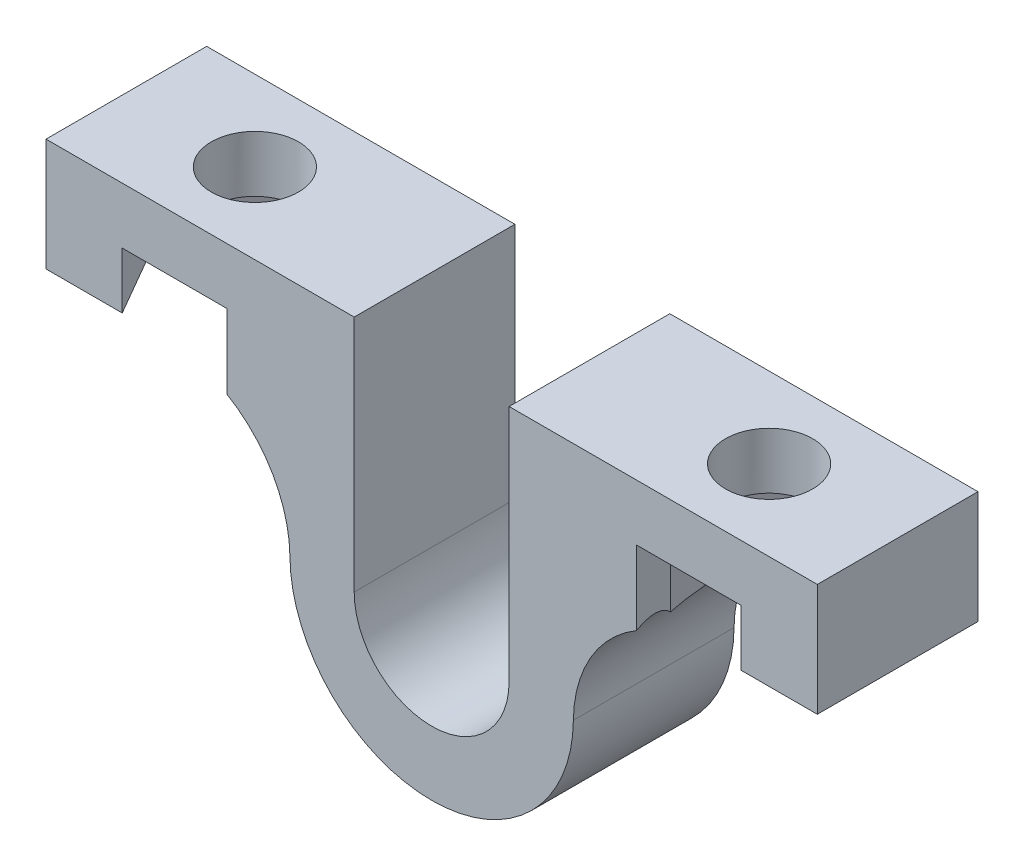
ISO-10303-21;
HEADER;
FILE_DESCRIPTION(('STEP AP214'),'2;1');
FILE_NAME('part.step','',(''),(''),'','','');
FILE_SCHEMA(('AUTOMOTIVE_DESIGN { 1 0 10303 214 1 1 1 1 }'));
ENDSEC;
DATA;
#1=APPLICATION_CONTEXT('core data for automotive mechanical design processes');
#2=APPLICATION_PROTOCOL_DEFINITION('international standard','automotive_design',2000,#1);
#3=PRODUCT_CONTEXT('',#1,'mechanical');
#4=PRODUCT('Part','Part','',(#3));
#5=PRODUCT_RELATED_PRODUCT_CATEGORY('part','',(#4));
#6=PRODUCT_DEFINITION_FORMATION('','',#4);
#7=PRODUCT_DEFINITION_CONTEXT('part definition',#1,'design');
#8=PRODUCT_DEFINITION('design','',#6,#7);
#9=PRODUCT_DEFINITION_SHAPE('','',#8);
#10=(LENGTH_UNIT() NAMED_UNIT(*) SI_UNIT(.MILLI.,.METRE.));
#11=(NAMED_UNIT(*) PLANE_ANGLE_UNIT() SI_UNIT($,.RADIAN.));
#12=(NAMED_UNIT(*) SI_UNIT($,.STERADIAN.) SOLID_ANGLE_UNIT());
#13=UNCERTAINTY_MEASURE_WITH_UNIT(LENGTH_MEASURE(1.E-05),#10,'distance_accuracy_value','');
#14=(GEOMETRIC_REPRESENTATION_CONTEXT(3) GLOBAL_UNCERTAINTY_ASSIGNED_CONTEXT((#13)) GLOBAL_UNIT_ASSIGNED_CONTEXT((#10,
#11,#12)) REPRESENTATION_CONTEXT('',''));
#15=CARTESIAN_POINT('',(0.,0.,0.));
#16=DIRECTION('',(0.,0.,1.));
#17=DIRECTION('',(1.,0.,0.));
#18=AXIS2_PLACEMENT_3D('',#15,#16,#17);
#19=CARTESIAN_POINT('',(-19.05,6.207125,7.9375));
#20=DIRECTION('',(0.,1.,0.));
#21=DIRECTION('',(0.,0.,1.));
#22=AXIS2_PLACEMENT_3D('',#19,#20,#21);
#23=PLANE('',#22);
#24=DIRECTION('',(-0.5,0.,-0.866025403784439));
#25=VECTOR('',#24,1.);
#26=CARTESIAN_POINT('',(-16.2259896131959,6.207125,6.30705684298438));
#27=LINE('',#26,#25);
#28=CARTESIAN_POINT('',(-15.2846528175946,6.207125,7.9375));
#29=VERTEX_POINT('',#28);
#30=CARTESIAN_POINT('',(-17.5760116984409,6.207125,3.96875));
#31=VERTEX_POINT('',#30);
#32=EDGE_CURVE('E183',#29,#31,#27,.T.);
#33=ORIENTED_EDGE('',*,*,#32,.F.);
#34=DIRECTION('',(1.,0.,0.));
#35=VECTOR('',#34,1.);
#36=CARTESIAN_POINT('',(-19.05,6.207125,7.9375));
#37=LINE('',#36,#35);
#38=CARTESIAN_POINT('',(-19.05,6.207125,7.9375));
#39=VERTEX_POINT('',#38);
#40=EDGE_CURVE('E142',#39,#29,#37,.T.);
#41=ORIENTED_EDGE('',*,*,#40,.F.);
#42=DIRECTION('',(0.,0.,-1.));
#43=VECTOR('',#42,1.);
#44=CARTESIAN_POINT('',(-19.05,6.207125,7.9375));
#45=LINE('',#44,#43);
#46=CARTESIAN_POINT('',(-19.05,6.207125,0.));
#47=VERTEX_POINT('',#46);
#48=EDGE_CURVE('E123',#39,#47,#45,.T.);
#49=ORIENTED_EDGE('',*,*,#48,.T.);
#50=DIRECTION('',(1.,0.,0.));
#51=VECTOR('',#50,1.);
#52=CARTESIAN_POINT('',(-19.05,6.207125,0.));
#53=LINE('',#52,#51);
#54=CARTESIAN_POINT('',(-15.2846528175946,6.207125,0.));
#55=VERTEX_POINT('',#54);
#56=EDGE_CURVE('E127',#47,#55,#53,.T.);
#57=ORIENTED_EDGE('',*,*,#56,.T.);
#58=DIRECTION('',(0.5,0.,-0.866025403784439));
#59=VECTOR('',#58,1.);
#60=CARTESIAN_POINT('',(-19.6630279344654,6.207125,7.58356815701562));
#61=LINE('',#60,#59);
#62=EDGE_CURVE('E187',#31,#55,#61,.T.);
#63=ORIENTED_EDGE('',*,*,#62,.F.);
#64=EDGE_LOOP('',(#33,#41,#49,#57,#63));
#65=FACE_BOUND('',#64,.T.);
#66=ADVANCED_FACE('F35',(#65),#23,.F.);
#67=CARTESIAN_POINT('',(-13.3501104864342,-0.142875000000001,7.9375));
#68=DIRECTION('',(0.,0.,-1.));
#69=DIRECTION('',(-1.,0.,0.));
#70=AXIS2_PLACEMENT_3D('',#67,#68,#69);
#71=CYLINDRICAL_SURFACE('',#70,6.35);
#72=CARTESIAN_POINT('',(-13.3501104864342,-0.142875000000001,-5.60277439303745));
#73=DIRECTION('',(-0.866025403784439,0.,0.5));
#74=DIRECTION('',(-0.5,0.,-0.866025403784439));
#75=AXIS2_PLACEMENT_3D('',#72,#73,#74);
#76=ELLIPSE('',#75,12.7,6.35);
#77=CARTESIAN_POINT('',(-10.1153471824053,5.32144621739818,0.));
#78=VERTEX_POINT('',#77);
#79=CARTESIAN_POINT('',(-7.82398830155895,2.98513932187094,3.96875));
#80=VERTEX_POINT('',#79);
#81=EDGE_CURVE('E190',#78,#80,#76,.F.);
#82=ORIENTED_EDGE('',*,*,#81,.F.);
#83=CARTESIAN_POINT('',(-13.3501104864342,-0.142875000000001,0.));
#84=DIRECTION('',(0.,0.,-1.));
#85=DIRECTION('',(1.,0.,0.));
#86=AXIS2_PLACEMENT_3D('',#83,#84,#85);
#87=CIRCLE('',#86,6.35);
#88=CARTESIAN_POINT('',(-7.00047410763077,-0.0749201843043985,0.));
#89=VERTEX_POINT('',#88);
#90=EDGE_CURVE('E130',#78,#89,#87,.T.);
#91=ORIENTED_EDGE('',*,*,#90,.T.);
#92=DIRECTION('',(0.,0.,-1.));
#93=VECTOR('',#92,1.);
#94=CARTESIAN_POINT('',(-7.00047410763077,-0.0749201843043985,7.9375));
#95=LINE('',#94,#93);
#96=CARTESIAN_POINT('',(-7.00047410763077,-0.0749201843043985,7.9375));
#97=VERTEX_POINT('',#96);
#98=EDGE_CURVE('E146',#97,#89,#95,.T.);
#99=ORIENTED_EDGE('',*,*,#98,.F.);
#100=CARTESIAN_POINT('',(-13.3501104864342,-0.142875000000001,7.9375));
#101=DIRECTION('',(0.,0.,-1.));
#102=DIRECTION('',(1.,0.,0.));
#103=AXIS2_PLACEMENT_3D('',#100,#101,#102);
#104=CIRCLE('',#103,6.35);
#105=CARTESIAN_POINT('',(-10.1153471824053,5.32144621739818,7.9375));
#106=VERTEX_POINT('',#105);
#107=EDGE_CURVE('E90',#106,#97,#104,.T.);
#108=ORIENTED_EDGE('',*,*,#107,.F.);
#109=CARTESIAN_POINT('',(-13.3501104864342,-0.142875000000001,13.5402743930374));
#110=DIRECTION('',(-0.866025403784438,0.,-0.5));
#111=DIRECTION('',(0.5,0.,-0.866025403784438));
#112=AXIS2_PLACEMENT_3D('',#109,#110,#111);
#113=ELLIPSE('',#112,12.7,6.35);
#114=EDGE_CURVE('E174',#80,#106,#113,.F.);
#115=ORIENTED_EDGE('',*,*,#114,.F.);
#116=EDGE_LOOP('',(#82,#91,#99,#108,#115));
#117=FACE_BOUND('',#116,.T.);
#118=ADVANCED_FACE('F172',(#117),#71,.F.);
#119=CARTESIAN_POINT('',(-13.3501104864342,-0.142875000000001,7.9375));
#120=DIRECTION('',(0.,0.,1.));
#121=DIRECTION('',(1.,0.,0.));
#122=AXIS2_PLACEMENT_3D('',#119,#120,#121);
#123=PLANE('',#122);
#124=ORIENTED_EDGE('',*,*,#40,.T.);
#125=DIRECTION('',(0.,1.,0.));
#126=VECTOR('',#125,1.);
#127=CARTESIAN_POINT('',(-15.2846528175946,-0.142875000000001,7.9375));
#128=LINE('',#127,#126);
#129=CARTESIAN_POINT('',(-15.2846528175946,8.98525,7.9375));
#130=VERTEX_POINT('',#129);
#131=EDGE_CURVE('E11',#29,#130,#128,.T.);
#132=ORIENTED_EDGE('',*,*,#131,.T.);
#133=DIRECTION('',(1.,0.,0.));
#134=VECTOR('',#133,1.);
#135=CARTESIAN_POINT('',(-13.3501104864342,8.98525,7.9375));
#136=LINE('',#135,#134);
#137=CARTESIAN_POINT('',(-10.1153471824053,8.98525,7.9375));
#138=VERTEX_POINT('',#137);
#139=EDGE_CURVE('E163',#130,#138,#136,.T.);
#140=ORIENTED_EDGE('',*,*,#139,.T.);
#141=DIRECTION('',(0.,-1.,0.));
#142=VECTOR('',#141,1.);
#143=CARTESIAN_POINT('',(-10.1153471824053,-0.142875000000001,7.9375));
#144=LINE('',#143,#142);
#145=EDGE_CURVE('E42',#138,#106,#144,.T.);
#146=ORIENTED_EDGE('',*,*,#145,.T.);
#147=ORIENTED_EDGE('',*,*,#107,.T.);
#148=CARTESIAN_POINT('',(0.,0.,7.9375));
#149=DIRECTION('',(0.,0.,1.));
#150=DIRECTION('',(1.,0.,0.));
#151=AXIS2_PLACEMENT_3D('',#148,#149,#150);
#152=CIRCLE('',#151,7.000875);
#153=CARTESIAN_POINT('',(7.00047410763077,-0.0749201843043987,7.9375));
#154=VERTEX_POINT('',#153);
#155=EDGE_CURVE('E176',#97,#154,#152,.T.);
#156=ORIENTED_EDGE('',*,*,#155,.T.);
#157=CARTESIAN_POINT('',(13.3501104864342,-0.142875000000001,7.9375));
#158=DIRECTION('',(0.,0.,1.));
#159=DIRECTION('',(-1.,0.,0.));
#160=AXIS2_PLACEMENT_3D('',#157,#158,#159);
#161=CIRCLE('',#160,6.35);
#162=CARTESIAN_POINT('',(10.1153471824053,5.32144621739818,7.9375));
#163=VERTEX_POINT('',#162);
#164=EDGE_CURVE('E266',#163,#154,#161,.T.);
#165=ORIENTED_EDGE('',*,*,#164,.F.);
#166=DIRECTION('',(0.,-1.,0.));
#167=VECTOR('',#166,1.);
#168=CARTESIAN_POINT('',(10.1153471824053,-0.142875000000001,7.9375));
#169=LINE('',#168,#167);
#170=CARTESIAN_POINT('',(10.1153471824053,8.98525,7.9375));
#171=VERTEX_POINT('',#170);
#172=EDGE_CURVE('E211',#171,#163,#169,.T.);
#173=ORIENTED_EDGE('',*,*,#172,.F.);
#174=DIRECTION('',(-1.,0.,0.));
#175=VECTOR('',#174,1.);
#176=CARTESIAN_POINT('',(13.3501104864342,8.98525,7.9375));
#177=LINE('',#176,#175);
#178=CARTESIAN_POINT('',(15.2846528175946,8.98525,7.9375));
#179=VERTEX_POINT('',#178);
#180=EDGE_CURVE('E285',#179,#171,#177,.T.);
#181=ORIENTED_EDGE('',*,*,#180,.F.);
#182=DIRECTION('',(0.,1.,0.));
#183=VECTOR('',#182,1.);
#184=CARTESIAN_POINT('',(15.2846528175946,-0.142875000000001,7.9375));
#185=LINE('',#184,#183);
#186=CARTESIAN_POINT('',(15.2846528175946,6.207125,7.9375));
#187=VERTEX_POINT('',#186);
#188=EDGE_CURVE('E208',#187,#179,#185,.T.);
#189=ORIENTED_EDGE('',*,*,#188,.F.);
#190=DIRECTION('',(-1.,0.,0.));
#191=VECTOR('',#190,1.);
#192=CARTESIAN_POINT('',(19.05,6.207125,7.9375));
#193=LINE('',#192,#191);
#194=CARTESIAN_POINT('',(19.05,6.207125,7.9375));
#195=VERTEX_POINT('',#194);
#196=EDGE_CURVE('E244',#195,#187,#193,.T.);
#197=ORIENTED_EDGE('',*,*,#196,.F.);
#198=DIRECTION('',(0.,-1.,0.));
#199=VECTOR('',#198,1.);
#200=CARTESIAN_POINT('',(19.05,11.763375,7.9375));
#201=LINE('',#200,#199);
#202=CARTESIAN_POINT('',(19.05,11.763375,7.9375));
#203=VERTEX_POINT('',#202);
#204=EDGE_CURVE('E240',#203,#195,#201,.T.);
#205=ORIENTED_EDGE('',*,*,#204,.F.);
#206=DIRECTION('',(1.,0.,0.));
#207=VECTOR('',#206,1.);
#208=CARTESIAN_POINT('',(19.05,11.763375,7.9375));
#209=LINE('',#208,#207);
#210=CARTESIAN_POINT('',(3.825875,11.763375,7.9375));
#211=VERTEX_POINT('',#210);
#212=EDGE_CURVE('E260',#211,#203,#209,.T.);
#213=ORIENTED_EDGE('',*,*,#212,.F.);
#214=DIRECTION('',(0.,1.,0.));
#215=VECTOR('',#214,1.);
#216=CARTESIAN_POINT('',(3.825875,0.,7.9375));
#217=LINE('',#216,#215);
#218=CARTESIAN_POINT('',(3.825875,0.,7.9375));
#219=VERTEX_POINT('',#218);
#220=EDGE_CURVE('E263',#219,#211,#217,.T.);
#221=ORIENTED_EDGE('',*,*,#220,.F.);
#222=CARTESIAN_POINT('',(0.,0.,7.9375));
#223=DIRECTION('',(0.,0.,-1.));
#224=DIRECTION('',(1.,0.,0.));
#225=AXIS2_PLACEMENT_3D('',#222,#223,#224);
#226=CIRCLE('',#225,3.825875);
#227=CARTESIAN_POINT('',(-3.825875,0.,7.9375));
#228=VERTEX_POINT('',#227);
#229=EDGE_CURVE('E106',#219,#228,#226,.T.);
#230=ORIENTED_EDGE('',*,*,#229,.T.);
#231=DIRECTION('',(0.,1.,0.));
#232=VECTOR('',#231,1.);
#233=CARTESIAN_POINT('',(-3.825875,0.,7.9375));
#234=LINE('',#233,#232);
#235=CARTESIAN_POINT('',(-3.825875,11.763375,7.9375));
#236=VERTEX_POINT('',#235);
#237=EDGE_CURVE('E98',#228,#236,#234,.T.);
#238=ORIENTED_EDGE('',*,*,#237,.T.);
#239=DIRECTION('',(-1.,0.,0.));
#240=VECTOR('',#239,1.);
#241=CARTESIAN_POINT('',(-19.05,11.763375,7.9375));
#242=LINE('',#241,#240);
#243=CARTESIAN_POINT('',(-19.05,11.763375,7.9375));
#244=VERTEX_POINT('',#243);
#245=EDGE_CURVE('E102',#236,#244,#242,.T.);
#246=ORIENTED_EDGE('',*,*,#245,.T.);
#247=DIRECTION('',(0.,-1.,0.));
#248=VECTOR('',#247,1.);
#249=CARTESIAN_POINT('',(-19.05,11.763375,7.9375));
#250=LINE('',#249,#248);
#251=EDGE_CURVE('E58',#244,#39,#250,.T.);
#252=ORIENTED_EDGE('',*,*,#251,.T.);
#253=EDGE_LOOP('',(#124,#132,#140,#146,#147,#156,#165,#173,#181,#189,#197,#205,#213,#221,#230,
#238,#246,#252));
#254=FACE_BOUND('',#253,.T.);
#255=ADVANCED_FACE('F100',(#254),#123,.T.);
#256=CARTESIAN_POINT('',(-13.3501104864342,-0.142875000000001,0.));
#257=DIRECTION('',(0.,0.,1.));
#258=DIRECTION('',(1.,0.,0.));
#259=AXIS2_PLACEMENT_3D('',#256,#257,#258);
#260=PLANE('',#259);
#261=DIRECTION('',(0.,1.,0.));
#262=VECTOR('',#261,1.);
#263=CARTESIAN_POINT('',(-15.2846528175946,-0.142875000000001,0.));
#264=LINE('',#263,#262);
#265=CARTESIAN_POINT('',(-15.2846528175946,8.98525,0.));
#266=VERTEX_POINT('',#265);
#267=EDGE_CURVE('E157',#55,#266,#264,.T.);
#268=ORIENTED_EDGE('',*,*,#267,.F.);
#269=ORIENTED_EDGE('',*,*,#56,.F.);
#270=DIRECTION('',(0.,-1.,0.));
#271=VECTOR('',#270,1.);
#272=CARTESIAN_POINT('',(-19.05,11.763375,0.));
#273=LINE('',#272,#271);
#274=CARTESIAN_POINT('',(-19.05,11.763375,0.));
#275=VERTEX_POINT('',#274);
#276=EDGE_CURVE('E82',#275,#47,#273,.T.);
#277=ORIENTED_EDGE('',*,*,#276,.F.);
#278=DIRECTION('',(-1.,0.,0.));
#279=VECTOR('',#278,1.);
#280=CARTESIAN_POINT('',(-19.05,11.763375,0.));
#281=LINE('',#280,#279);
#282=CARTESIAN_POINT('',(-3.825875,11.763375,0.));
#283=VERTEX_POINT('',#282);
#284=EDGE_CURVE('E139',#283,#275,#281,.T.);
#285=ORIENTED_EDGE('',*,*,#284,.F.);
#286=DIRECTION('',(0.,1.,0.));
#287=VECTOR('',#286,1.);
#288=CARTESIAN_POINT('',(-3.825875,0.,0.));
#289=LINE('',#288,#287);
#290=CARTESIAN_POINT('',(-3.825875,0.,0.));
#291=VERTEX_POINT('',#290);
#292=EDGE_CURVE('E115',#291,#283,#289,.T.);
#293=ORIENTED_EDGE('',*,*,#292,.F.);
#294=CARTESIAN_POINT('',(0.,0.,0.));
#295=DIRECTION('',(0.,0.,-1.));
#296=DIRECTION('',(1.,0.,0.));
#297=AXIS2_PLACEMENT_3D('',#294,#295,#296);
#298=CIRCLE('',#297,3.825875);
#299=CARTESIAN_POINT('',(3.825875,0.,0.));
#300=VERTEX_POINT('',#299);
#301=EDGE_CURVE('E136',#300,#291,#298,.T.);
#302=ORIENTED_EDGE('',*,*,#301,.F.);
#303=DIRECTION('',(0.,1.,0.));
#304=VECTOR('',#303,1.);
#305=CARTESIAN_POINT('',(3.825875,0.,0.));
#306=LINE('',#305,#304);
#307=CARTESIAN_POINT('',(3.825875,11.763375,0.));
#308=VERTEX_POINT('',#307);
#309=EDGE_CURVE('E248',#300,#308,#306,.T.);
#310=ORIENTED_EDGE('',*,*,#309,.T.);
#311=DIRECTION('',(1.,0.,0.));
#312=VECTOR('',#311,1.);
#313=CARTESIAN_POINT('',(19.05,11.763375,0.));
#314=LINE('',#313,#312);
#315=CARTESIAN_POINT('',(19.05,11.763375,0.));
#316=VERTEX_POINT('',#315);
#317=EDGE_CURVE('E245',#308,#316,#314,.T.);
#318=ORIENTED_EDGE('',*,*,#317,.T.);
#319=DIRECTION('',(0.,-1.,0.));
#320=VECTOR('',#319,1.);
#321=CARTESIAN_POINT('',(19.05,11.763375,0.));
#322=LINE('',#321,#320);
#323=CARTESIAN_POINT('',(19.05,6.207125,0.));
#324=VERTEX_POINT('',#323);
#325=EDGE_CURVE('E241',#316,#324,#322,.T.);
#326=ORIENTED_EDGE('',*,*,#325,.T.);
#327=DIRECTION('',(-1.,0.,0.));
#328=VECTOR('',#327,1.);
#329=CARTESIAN_POINT('',(19.05,6.207125,0.));
#330=LINE('',#329,#328);
#331=CARTESIAN_POINT('',(15.2846528175946,6.207125,0.));
#332=VERTEX_POINT('',#331);
#333=EDGE_CURVE('E254',#324,#332,#330,.T.);
#334=ORIENTED_EDGE('',*,*,#333,.T.);
#335=DIRECTION('',(0.,1.,0.));
#336=VECTOR('',#335,1.);
#337=CARTESIAN_POINT('',(15.2846528175946,-0.142875000000001,0.));
#338=LINE('',#337,#336);
#339=CARTESIAN_POINT('',(15.2846528175946,8.98525,0.));
#340=VERTEX_POINT('',#339);
#341=EDGE_CURVE('E214',#332,#340,#338,.T.);
#342=ORIENTED_EDGE('',*,*,#341,.T.);
#343=DIRECTION('',(-1.,0.,0.));
#344=VECTOR('',#343,1.);
#345=CARTESIAN_POINT('',(13.3501104864342,8.98525,0.));
#346=LINE('',#345,#344);
#347=CARTESIAN_POINT('',(10.1153471824053,8.98525,0.));
#348=VERTEX_POINT('',#347);
#349=EDGE_CURVE('E224',#340,#348,#346,.T.);
#350=ORIENTED_EDGE('',*,*,#349,.T.);
#351=DIRECTION('',(0.,-1.,0.));
#352=VECTOR('',#351,1.);
#353=CARTESIAN_POINT('',(10.1153471824053,-0.142875000000001,0.));
#354=LINE('',#353,#352);
#355=CARTESIAN_POINT('',(10.1153471824053,5.32144621739818,0.));
#356=VERTEX_POINT('',#355);
#357=EDGE_CURVE('E217',#348,#356,#354,.T.);
#358=ORIENTED_EDGE('',*,*,#357,.T.);
#359=CARTESIAN_POINT('',(13.3501104864342,-0.142875000000001,0.));
#360=DIRECTION('',(0.,0.,1.));
#361=DIRECTION('',(-1.,0.,0.));
#362=AXIS2_PLACEMENT_3D('',#359,#360,#361);
#363=CIRCLE('',#362,6.35);
#364=CARTESIAN_POINT('',(7.00047410763077,-0.0749201843043987,0.));
#365=VERTEX_POINT('',#364);
#366=EDGE_CURVE('E251',#356,#365,#363,.T.);
#367=ORIENTED_EDGE('',*,*,#366,.T.);
#368=CARTESIAN_POINT('',(0.,0.,0.));
#369=DIRECTION('',(0.,0.,1.));
#370=DIRECTION('',(1.,0.,0.));
#371=AXIS2_PLACEMENT_3D('',#368,#369,#370);
#372=CIRCLE('',#371,7.000875);
#373=EDGE_CURVE('E133',#89,#365,#372,.T.);
#374=ORIENTED_EDGE('',*,*,#373,.F.);
#375=ORIENTED_EDGE('',*,*,#90,.F.);
#376=DIRECTION('',(0.,-1.,0.));
#377=VECTOR('',#376,1.);
#378=CARTESIAN_POINT('',(-10.1153471824053,-0.142875000000001,0.));
#379=LINE('',#378,#377);
#380=CARTESIAN_POINT('',(-10.1153471824053,8.98525,0.));
#381=VERTEX_POINT('',#380);
#382=EDGE_CURVE('E149',#381,#78,#379,.T.);
#383=ORIENTED_EDGE('',*,*,#382,.F.);
#384=DIRECTION('',(1.,0.,0.));
#385=VECTOR('',#384,1.);
#386=CARTESIAN_POINT('',(-13.3501104864342,8.98525,0.));
#387=LINE('',#386,#385);
#388=EDGE_CURVE('E153',#266,#381,#387,.T.);
#389=ORIENTED_EDGE('',*,*,#388,.F.);
#390=EDGE_LOOP('',(#268,#269,#277,#285,#293,#302,#310,#318,#326,#334,#342,#350,#358,#367,#374,
#375,#383,#389));
#391=FACE_BOUND('',#390,.T.);
#392=ADVANCED_FACE('F395',(#391),#260,.F.);
#393=CARTESIAN_POINT('',(-12.6999999999999,11.763375,3.96875));
#394=DIRECTION('',(0.,1.,0.));
#395=DIRECTION('',(0.,0.,1.));
#396=AXIS2_PLACEMENT_3D('',#393,#394,#395);
#397=CYLINDRICAL_SURFACE('',#396,2.15264999999999);
#398=CARTESIAN_POINT('',(-12.6999999999999,11.763375,3.96875));
#399=DIRECTION('',(0.,1.,0.));
#400=DIRECTION('',(0.,0.,1.));
#401=AXIS2_PLACEMENT_3D('',#398,#399,#400);
#402=CIRCLE('',#401,2.15264999999999);
#403=CARTESIAN_POINT('',(-12.6999999999999,11.763375,6.12139999999999));
#404=VERTEX_POINT('',#403);
#405=EDGE_CURVE('E131',#404,#404,#402,.T.);
#406=ORIENTED_EDGE('',*,*,#405,.T.);
#407=EDGE_LOOP('',(#406));
#408=FACE_BOUND('',#407,.T.);
#409=CARTESIAN_POINT('',(-12.6999999999999,8.98525,3.96875));
#410=DIRECTION('',(0.,-1.,0.));
#411=DIRECTION('',(0.,0.,-1.));
#412=AXIS2_PLACEMENT_3D('',#409,#410,#411);
#413=CIRCLE('',#412,2.15264999999999);
#414=CARTESIAN_POINT('',(-12.6999999999999,8.98525,1.81610000000001));
#415=VERTEX_POINT('',#414);
#416=EDGE_CURVE('E150',#415,#415,#413,.F.);
#417=ORIENTED_EDGE('',*,*,#416,.F.);
#418=EDGE_LOOP('',(#417));
#419=FACE_BOUND('',#418,.T.);
#420=ADVANCED_FACE('F457',(#408,#419),#397,.F.);
#421=CARTESIAN_POINT('',(0.,0.,7.9375));
#422=DIRECTION('',(0.,0.,-1.));
#423=DIRECTION('',(-1.,0.,0.));
#424=AXIS2_PLACEMENT_3D('',#421,#422,#423);
#425=CYLINDRICAL_SURFACE('',#424,7.000875);
#426=ORIENTED_EDGE('',*,*,#373,.T.);
#427=DIRECTION('',(0.,0.,-1.));
#428=VECTOR('',#427,1.);
#429=CARTESIAN_POINT('',(7.00047410763077,-0.0749201843043987,7.9375));
#430=LINE('',#429,#428);
#431=EDGE_CURVE('E220',#154,#365,#430,.T.);
#432=ORIENTED_EDGE('',*,*,#431,.F.);
#433=ORIENTED_EDGE('',*,*,#155,.F.);
#434=ORIENTED_EDGE('',*,*,#98,.T.);
#435=EDGE_LOOP('',(#426,#432,#433,#434));
#436=FACE_BOUND('',#435,.T.);
#437=ADVANCED_FACE('F432',(#436),#425,.T.);
#438=CARTESIAN_POINT('',(0.,0.,7.9375));
#439=DIRECTION('',(0.,0.,-1.));
#440=DIRECTION('',(-1.,0.,0.));
#441=AXIS2_PLACEMENT_3D('',#438,#439,#440);
#442=CYLINDRICAL_SURFACE('',#441,3.825875);
#443=ORIENTED_EDGE('',*,*,#301,.T.);
#444=DIRECTION('',(0.,0.,-1.));
#445=VECTOR('',#444,1.);
#446=CARTESIAN_POINT('',(-3.825875,0.,7.9375));
#447=LINE('',#446,#445);
#448=EDGE_CURVE('E118',#228,#291,#447,.T.);
#449=ORIENTED_EDGE('',*,*,#448,.F.);
#450=ORIENTED_EDGE('',*,*,#229,.F.);
#451=DIRECTION('',(0.,0.,-1.));
#452=VECTOR('',#451,1.);
#453=CARTESIAN_POINT('',(3.825875,0.,7.9375));
#454=LINE('',#453,#452);
#455=EDGE_CURVE('E228',#219,#300,#454,.T.);
#456=ORIENTED_EDGE('',*,*,#455,.T.);
#457=EDGE_LOOP('',(#443,#449,#450,#456));
#458=FACE_BOUND('',#457,.T.);
#459=ADVANCED_FACE('F402',(#458),#442,.F.);
#460=CARTESIAN_POINT('',(-3.825875,0.,7.9375));
#461=DIRECTION('',(-1.,0.,0.));
#462=DIRECTION('',(0.,-1.,0.));
#463=AXIS2_PLACEMENT_3D('',#460,#461,#462);
#464=PLANE('',#463);
#465=ORIENTED_EDGE('',*,*,#292,.T.);
#466=DIRECTION('',(0.,0.,-1.));
#467=VECTOR('',#466,1.);
#468=CARTESIAN_POINT('',(-3.825875,11.763375,7.9375));
#469=LINE('',#468,#467);
#470=EDGE_CURVE('E112',#236,#283,#469,.T.);
#471=ORIENTED_EDGE('',*,*,#470,.F.);
#472=ORIENTED_EDGE('',*,*,#237,.F.);
#473=ORIENTED_EDGE('',*,*,#448,.T.);
#474=EDGE_LOOP('',(#465,#471,#472,#473));
#475=FACE_BOUND('',#474,.T.);
#476=ADVANCED_FACE('F113',(#475),#464,.F.);
#477=CARTESIAN_POINT('',(-19.05,11.763375,7.9375));
#478=DIRECTION('',(0.,-1.,0.));
#479=DIRECTION('',(0.,0.,-1.));
#480=AXIS2_PLACEMENT_3D('',#477,#478,#479);
#481=PLANE('',#480);
#482=ORIENTED_EDGE('',*,*,#405,.F.);
#483=EDGE_LOOP('',(#482));
#484=FACE_BOUND('',#483,.T.);
#485=ORIENTED_EDGE('',*,*,#284,.T.);
#486=DIRECTION('',(0.,0.,-1.));
#487=VECTOR('',#486,1.);
#488=CARTESIAN_POINT('',(-19.05,11.763375,7.9375));
#489=LINE('',#488,#487);
#490=EDGE_CURVE('E119',#244,#275,#489,.T.);
#491=ORIENTED_EDGE('',*,*,#490,.F.);
#492=ORIENTED_EDGE('',*,*,#245,.F.);
#493=ORIENTED_EDGE('',*,*,#470,.T.);
#494=EDGE_LOOP('',(#485,#491,#492,#493));
#495=FACE_BOUND('',#494,.T.);
#496=ADVANCED_FACE('F121',(#484,#495),#481,.F.);
#497=CARTESIAN_POINT('',(-19.05,11.763375,7.9375));
#498=DIRECTION('',(1.,0.,0.));
#499=DIRECTION('',(0.,0.,-1.));
#500=AXIS2_PLACEMENT_3D('',#497,#498,#499);
#501=PLANE('',#500);
#502=ORIENTED_EDGE('',*,*,#276,.T.);
#503=ORIENTED_EDGE('',*,*,#48,.F.);
#504=ORIENTED_EDGE('',*,*,#251,.F.);
#505=ORIENTED_EDGE('',*,*,#490,.T.);
#506=EDGE_LOOP('',(#502,#503,#504,#505));
#507=FACE_BOUND('',#506,.T.);
#508=ADVANCED_FACE('F398',(#507),#501,.F.);
#509=CARTESIAN_POINT('',(-15.1380058492204,-7.000875,8.1915));
#510=DIRECTION('',(0.866025403784439,0.,-0.5));
#511=DIRECTION('',(-0.5,0.,-0.866025403784439));
#512=AXIS2_PLACEMENT_3D('',#509,#510,#511);
#513=PLANE('',#512);
#514=ORIENTED_EDGE('',*,*,#32,.T.);
#515=DIRECTION('',(0.,1.,0.));
#516=VECTOR('',#515,1.);
#517=CARTESIAN_POINT('',(-17.5760116984409,-7.000875,3.96875));
#518=LINE('',#517,#516);
#519=CARTESIAN_POINT('',(-17.5760116984409,8.98525,3.96875));
#520=VERTEX_POINT('',#519);
#521=EDGE_CURVE('E154',#31,#520,#518,.T.);
#522=ORIENTED_EDGE('',*,*,#521,.T.);
#523=DIRECTION('',(-0.5,0.,-0.866025403784439));
#524=VECTOR('',#523,1.);
#525=CARTESIAN_POINT('',(-15.1380058492204,8.98525,8.1915));
#526=LINE('',#525,#524);
#527=EDGE_CURVE('E206',#130,#520,#526,.T.);
#528=ORIENTED_EDGE('',*,*,#527,.F.);
#529=ORIENTED_EDGE('',*,*,#131,.F.);
#530=EDGE_LOOP('',(#514,#522,#528,#529));
#531=FACE_BOUND('',#530,.T.);
#532=ADVANCED_FACE('F467',(#531),#513,.T.);
#533=CARTESIAN_POINT('',(-7.82398830155895,-7.000875,3.96875));
#534=DIRECTION('',(-0.866025403784438,0.,-0.5));
#535=DIRECTION('',(-0.5,0.,0.866025403784438));
#536=AXIS2_PLACEMENT_3D('',#533,#534,#535);
#537=PLANE('',#536);
#538=ORIENTED_EDGE('',*,*,#114,.T.);
#539=ORIENTED_EDGE('',*,*,#145,.F.);
#540=DIRECTION('',(-0.5,0.,0.866025403784438));
#541=VECTOR('',#540,1.);
#542=CARTESIAN_POINT('',(-7.82398830155895,8.98525,3.96875));
#543=LINE('',#542,#541);
#544=CARTESIAN_POINT('',(-7.82398830155895,8.98525,3.96875));
#545=VERTEX_POINT('',#544);
#546=EDGE_CURVE('E200',#545,#138,#543,.T.);
#547=ORIENTED_EDGE('',*,*,#546,.F.);
#548=DIRECTION('',(0.,1.,0.));
#549=VECTOR('',#548,1.);
#550=CARTESIAN_POINT('',(-7.82398830155895,-7.000875,3.96875));
#551=LINE('',#550,#549);
#552=EDGE_CURVE('E197',#80,#545,#551,.T.);
#553=ORIENTED_EDGE('',*,*,#552,.F.);
#554=EDGE_LOOP('',(#538,#539,#547,#553));
#555=FACE_BOUND('',#554,.T.);
#556=ADVANCED_FACE('F475',(#555),#537,.T.);
#557=CARTESIAN_POINT('',(-17.5760116984409,-7.000875,3.96875));
#558=DIRECTION('',(0.866025403784438,0.,0.5));
#559=DIRECTION('',(0.5,0.,-0.866025403784439));
#560=AXIS2_PLACEMENT_3D('',#557,#558,#559);
#561=PLANE('',#560);
#562=ORIENTED_EDGE('',*,*,#62,.T.);
#563=ORIENTED_EDGE('',*,*,#267,.T.);
#564=DIRECTION('',(0.5,0.,-0.866025403784439));
#565=VECTOR('',#564,1.);
#566=CARTESIAN_POINT('',(-17.5760116984409,8.98525,3.96875));
#567=LINE('',#566,#565);
#568=EDGE_CURVE('E49',#520,#266,#567,.T.);
#569=ORIENTED_EDGE('',*,*,#568,.F.);
#570=ORIENTED_EDGE('',*,*,#521,.F.);
#571=EDGE_LOOP('',(#562,#563,#569,#570));
#572=FACE_BOUND('',#571,.T.);
#573=ADVANCED_FACE('F389',(#572),#561,.T.);
#574=CARTESIAN_POINT('',(-10.2619941507794,-7.000875,-0.253999999999999));
#575=DIRECTION('',(-0.866025403784439,0.,0.5));
#576=DIRECTION('',(0.5,0.,0.866025403784439));
#577=AXIS2_PLACEMENT_3D('',#574,#575,#576);
#578=PLANE('',#577);
#579=ORIENTED_EDGE('',*,*,#81,.T.);
#580=ORIENTED_EDGE('',*,*,#552,.T.);
#581=DIRECTION('',(0.5,0.,0.866025403784439));
#582=VECTOR('',#581,1.);
#583=CARTESIAN_POINT('',(-10.2619941507794,8.98525,-0.253999999999999));
#584=LINE('',#583,#582);
#585=EDGE_CURVE('E202',#381,#545,#584,.T.);
#586=ORIENTED_EDGE('',*,*,#585,.F.);
#587=ORIENTED_EDGE('',*,*,#382,.T.);
#588=EDGE_LOOP('',(#579,#580,#586,#587));
#589=FACE_BOUND('',#588,.T.);
#590=ADVANCED_FACE('F479',(#589),#578,.T.);
#591=CARTESIAN_POINT('',(0.,8.98525,0.));
#592=DIRECTION('',(0.,-1.,0.));
#593=DIRECTION('',(0.,0.,-1.));
#594=AXIS2_PLACEMENT_3D('',#591,#592,#593);
#595=PLANE('',#594);
#596=ORIENTED_EDGE('',*,*,#416,.T.);
#597=EDGE_LOOP('',(#596));
#598=FACE_BOUND('',#597,.T.);
#599=ORIENTED_EDGE('',*,*,#527,.T.);
#600=ORIENTED_EDGE('',*,*,#568,.T.);
#601=ORIENTED_EDGE('',*,*,#388,.T.);
#602=ORIENTED_EDGE('',*,*,#585,.T.);
#603=ORIENTED_EDGE('',*,*,#546,.T.);
#604=ORIENTED_EDGE('',*,*,#139,.F.);
#605=EDGE_LOOP('',(#599,#600,#601,#602,#603,#604));
#606=FACE_BOUND('',#605,.T.);
#607=ADVANCED_FACE('F482',(#598,#606),#595,.T.);
#608=CARTESIAN_POINT('',(19.05,6.207125,7.9375));
#609=DIRECTION('',(0.,1.,0.));
#610=DIRECTION('',(0.,0.,1.));
#611=AXIS2_PLACEMENT_3D('',#608,#609,#610);
#612=PLANE('',#611);
#613=DIRECTION('',(0.5,0.,-0.866025403784439));
#614=VECTOR('',#613,1.);
#615=CARTESIAN_POINT('',(16.2259896131959,6.207125,6.30705684298438));
#616=LINE('',#615,#614);
#617=CARTESIAN_POINT('',(17.5760116984409,6.207125,3.96875));
#618=VERTEX_POINT('',#617);
#619=EDGE_CURVE('E273',#187,#618,#616,.T.);
#620=ORIENTED_EDGE('',*,*,#619,.T.);
#621=DIRECTION('',(-0.5,0.,-0.866025403784439));
#622=VECTOR('',#621,1.);
#623=CARTESIAN_POINT('',(19.6630279344654,6.207125,7.58356815701562));
#624=LINE('',#623,#622);
#625=EDGE_CURVE('E279',#618,#332,#624,.T.);
#626=ORIENTED_EDGE('',*,*,#625,.T.);
#627=ORIENTED_EDGE('',*,*,#333,.F.);
#628=DIRECTION('',(0.,0.,-1.));
#629=VECTOR('',#628,1.);
#630=CARTESIAN_POINT('',(19.05,6.207125,7.9375));
#631=LINE('',#630,#629);
#632=EDGE_CURVE('E237',#195,#324,#631,.T.);
#633=ORIENTED_EDGE('',*,*,#632,.F.);
#634=ORIENTED_EDGE('',*,*,#196,.T.);
#635=EDGE_LOOP('',(#620,#626,#627,#633,#634));
#636=FACE_BOUND('',#635,.T.);
#637=ADVANCED_FACE('F417',(#636),#612,.F.);
#638=CARTESIAN_POINT('',(13.3501104864342,-0.142875000000001,7.9375));
#639=DIRECTION('',(0.,0.,-1.));
#640=DIRECTION('',(1.,0.,0.));
#641=AXIS2_PLACEMENT_3D('',#638,#639,#640);
#642=CYLINDRICAL_SURFACE('',#641,6.35);
#643=CARTESIAN_POINT('',(13.3501104864342,-0.142875000000001,-5.60277439303745));
#644=DIRECTION('',(-0.866025403784439,0.,-0.5));
#645=DIRECTION('',(0.5,0.,-0.866025403784439));
#646=AXIS2_PLACEMENT_3D('',#643,#644,#645);
#647=ELLIPSE('',#646,12.7,6.35);
#648=CARTESIAN_POINT('',(7.82398830155895,2.98513932187094,3.96875));
#649=VERTEX_POINT('',#648);
#650=EDGE_CURVE('E282',#356,#649,#647,.F.);
#651=ORIENTED_EDGE('',*,*,#650,.T.);
#652=CARTESIAN_POINT('',(13.3501104864342,-0.142875000000001,13.5402743930374));
#653=DIRECTION('',(-0.866025403784438,0.,0.5));
#654=DIRECTION('',(-0.5,0.,-0.866025403784438));
#655=AXIS2_PLACEMENT_3D('',#652,#653,#654);
#656=ELLIPSE('',#655,12.7,6.35);
#657=EDGE_CURVE('E276',#649,#163,#656,.F.);
#658=ORIENTED_EDGE('',*,*,#657,.T.);
#659=ORIENTED_EDGE('',*,*,#164,.T.);
#660=ORIENTED_EDGE('',*,*,#431,.T.);
#661=ORIENTED_EDGE('',*,*,#366,.F.);
#662=EDGE_LOOP('',(#651,#658,#659,#660,#661));
#663=FACE_BOUND('',#662,.T.);
#664=ADVANCED_FACE('F427',(#663),#642,.F.);
#665=CARTESIAN_POINT('',(12.6999999999999,11.763375,3.96875));
#666=DIRECTION('',(0.,1.,0.));
#667=DIRECTION('',(0.,0.,1.));
#668=AXIS2_PLACEMENT_3D('',#665,#666,#667);
#669=CYLINDRICAL_SURFACE('',#668,2.15264999999999);
#670=CARTESIAN_POINT('',(12.6999999999999,11.763375,3.96875));
#671=DIRECTION('',(0.,-1.,0.));
#672=DIRECTION('',(0.,0.,1.));
#673=AXIS2_PLACEMENT_3D('',#670,#671,#672);
#674=CIRCLE('',#673,2.15264999999999);
#675=CARTESIAN_POINT('',(12.6999999999999,11.763375,6.12139999999999));
#676=VERTEX_POINT('',#675);
#677=EDGE_CURVE('E257',#676,#676,#674,.T.);
#678=ORIENTED_EDGE('',*,*,#677,.F.);
#679=EDGE_LOOP('',(#678));
#680=FACE_BOUND('',#679,.T.);
#681=CARTESIAN_POINT('',(12.6999999999999,8.98525,3.96875));
#682=DIRECTION('',(0.,1.,0.));
#683=DIRECTION('',(0.,0.,-1.));
#684=AXIS2_PLACEMENT_3D('',#681,#682,#683);
#685=CIRCLE('',#684,2.15264999999999);
#686=CARTESIAN_POINT('',(12.6999999999999,8.98525,1.81610000000001));
#687=VERTEX_POINT('',#686);
#688=EDGE_CURVE('E221',#687,#687,#685,.F.);
#689=ORIENTED_EDGE('',*,*,#688,.T.);
#690=EDGE_LOOP('',(#689));
#691=FACE_BOUND('',#690,.T.);
#692=ADVANCED_FACE('F493',(#680,#691),#669,.F.);
#693=CARTESIAN_POINT('',(3.825875,0.,7.9375));
#694=DIRECTION('',(1.,0.,0.));
#695=DIRECTION('',(0.,-1.,0.));
#696=AXIS2_PLACEMENT_3D('',#693,#694,#695);
#697=PLANE('',#696);
#698=ORIENTED_EDGE('',*,*,#309,.F.);
#699=ORIENTED_EDGE('',*,*,#455,.F.);
#700=ORIENTED_EDGE('',*,*,#220,.T.);
#701=DIRECTION('',(0.,0.,-1.));
#702=VECTOR('',#701,1.);
#703=CARTESIAN_POINT('',(3.825875,11.763375,7.9375));
#704=LINE('',#703,#702);
#705=EDGE_CURVE('E231',#211,#308,#704,.T.);
#706=ORIENTED_EDGE('',*,*,#705,.T.);
#707=EDGE_LOOP('',(#698,#699,#700,#706));
#708=FACE_BOUND('',#707,.T.);
#709=ADVANCED_FACE('F404',(#708),#697,.F.);
#710=CARTESIAN_POINT('',(19.05,11.763375,7.9375));
#711=DIRECTION('',(0.,-1.,0.));
#712=DIRECTION('',(0.,0.,-1.));
#713=AXIS2_PLACEMENT_3D('',#710,#711,#712);
#714=PLANE('',#713);
#715=ORIENTED_EDGE('',*,*,#677,.T.);
#716=EDGE_LOOP('',(#715));
#717=FACE_BOUND('',#716,.T.);
#718=ORIENTED_EDGE('',*,*,#317,.F.);
#719=ORIENTED_EDGE('',*,*,#705,.F.);
#720=ORIENTED_EDGE('',*,*,#212,.T.);
#721=DIRECTION('',(0.,0.,-1.));
#722=VECTOR('',#721,1.);
#723=CARTESIAN_POINT('',(19.05,11.763375,7.9375));
#724=LINE('',#723,#722);
#725=EDGE_CURVE('E234',#203,#316,#724,.T.);
#726=ORIENTED_EDGE('',*,*,#725,.T.);
#727=EDGE_LOOP('',(#718,#719,#720,#726));
#728=FACE_BOUND('',#727,.T.);
#729=ADVANCED_FACE('F408',(#717,#728),#714,.F.);
#730=CARTESIAN_POINT('',(19.05,11.763375,7.9375));
#731=DIRECTION('',(-1.,0.,0.));
#732=DIRECTION('',(0.,0.,-1.));
#733=AXIS2_PLACEMENT_3D('',#730,#731,#732);
#734=PLANE('',#733);
#735=ORIENTED_EDGE('',*,*,#325,.F.);
#736=ORIENTED_EDGE('',*,*,#725,.F.);
#737=ORIENTED_EDGE('',*,*,#204,.T.);
#738=ORIENTED_EDGE('',*,*,#632,.T.);
#739=EDGE_LOOP('',(#735,#736,#737,#738));
#740=FACE_BOUND('',#739,.T.);
#741=ADVANCED_FACE('F413',(#740),#734,.F.);
#742=CARTESIAN_POINT('',(15.1380058492204,-7.000875,8.1915));
#743=DIRECTION('',(-0.866025403784439,0.,-0.5));
#744=DIRECTION('',(0.5,0.,-0.866025403784439));
#745=AXIS2_PLACEMENT_3D('',#742,#743,#744);
#746=PLANE('',#745);
#747=ORIENTED_EDGE('',*,*,#619,.F.);
#748=ORIENTED_EDGE('',*,*,#188,.T.);
#749=DIRECTION('',(0.5,0.,-0.866025403784439));
#750=VECTOR('',#749,1.);
#751=CARTESIAN_POINT('',(15.1380058492204,8.98525,8.1915));
#752=LINE('',#751,#750);
#753=CARTESIAN_POINT('',(17.5760116984409,8.98525,3.96875));
#754=VERTEX_POINT('',#753);
#755=EDGE_CURVE('E304',#179,#754,#752,.T.);
#756=ORIENTED_EDGE('',*,*,#755,.T.);
#757=DIRECTION('',(0.,1.,0.));
#758=VECTOR('',#757,1.);
#759=CARTESIAN_POINT('',(17.5760116984409,-7.000875,3.96875));
#760=LINE('',#759,#758);
#761=EDGE_CURVE('E225',#618,#754,#760,.T.);
#762=ORIENTED_EDGE('',*,*,#761,.F.);
#763=EDGE_LOOP('',(#747,#748,#756,#762));
#764=FACE_BOUND('',#763,.T.);
#765=ADVANCED_FACE('F311',(#764),#746,.T.);
#766=CARTESIAN_POINT('',(7.82398830155895,-7.000875,3.96875));
#767=DIRECTION('',(0.866025403784438,0.,-0.5));
#768=DIRECTION('',(0.5,0.,0.866025403784438));
#769=AXIS2_PLACEMENT_3D('',#766,#767,#768);
#770=PLANE('',#769);
#771=ORIENTED_EDGE('',*,*,#657,.F.);
#772=DIRECTION('',(0.,1.,0.));
#773=VECTOR('',#772,1.);
#774=CARTESIAN_POINT('',(7.82398830155895,-7.000875,3.96875));
#775=LINE('',#774,#773);
#776=CARTESIAN_POINT('',(7.82398830155895,8.98525,3.96875));
#777=VERTEX_POINT('',#776);
#778=EDGE_CURVE('E292',#649,#777,#775,.T.);
#779=ORIENTED_EDGE('',*,*,#778,.T.);
#780=DIRECTION('',(0.5,0.,0.866025403784438));
#781=VECTOR('',#780,1.);
#782=CARTESIAN_POINT('',(7.82398830155895,8.98525,3.96875));
#783=LINE('',#782,#781);
#784=EDGE_CURVE('E295',#777,#171,#783,.T.);
#785=ORIENTED_EDGE('',*,*,#784,.T.);
#786=ORIENTED_EDGE('',*,*,#172,.T.);
#787=EDGE_LOOP('',(#771,#779,#785,#786));
#788=FACE_BOUND('',#787,.T.);
#789=ADVANCED_FACE('F435',(#788),#770,.T.);
#790=CARTESIAN_POINT('',(17.5760116984409,-7.000875,3.96875));
#791=DIRECTION('',(-0.866025403784438,0.,0.5));
#792=DIRECTION('',(-0.5,0.,-0.866025403784439));
#793=AXIS2_PLACEMENT_3D('',#790,#791,#792);
#794=PLANE('',#793);
#795=ORIENTED_EDGE('',*,*,#625,.F.);
#796=ORIENTED_EDGE('',*,*,#761,.T.);
#797=DIRECTION('',(-0.5,0.,-0.866025403784439));
#798=VECTOR('',#797,1.);
#799=CARTESIAN_POINT('',(17.5760116984409,8.98525,3.96875));
#800=LINE('',#799,#798);
#801=EDGE_CURVE('E301',#754,#340,#800,.T.);
#802=ORIENTED_EDGE('',*,*,#801,.T.);
#803=ORIENTED_EDGE('',*,*,#341,.F.);
#804=EDGE_LOOP('',(#795,#796,#802,#803));
#805=FACE_BOUND('',#804,.T.);
#806=ADVANCED_FACE('F419',(#805),#794,.T.);
#807=CARTESIAN_POINT('',(10.2619941507794,-7.000875,-0.253999999999999));
#808=DIRECTION('',(0.866025403784439,0.,0.5));
#809=DIRECTION('',(-0.5,0.,0.866025403784439));
#810=AXIS2_PLACEMENT_3D('',#807,#808,#809);
#811=PLANE('',#810);
#812=ORIENTED_EDGE('',*,*,#650,.F.);
#813=ORIENTED_EDGE('',*,*,#357,.F.);
#814=DIRECTION('',(-0.5,0.,0.866025403784439));
#815=VECTOR('',#814,1.);
#816=CARTESIAN_POINT('',(10.2619941507794,8.98525,-0.253999999999999));
#817=LINE('',#816,#815);
#818=EDGE_CURVE('E298',#348,#777,#817,.T.);
#819=ORIENTED_EDGE('',*,*,#818,.T.);
#820=ORIENTED_EDGE('',*,*,#778,.F.);
#821=EDGE_LOOP('',(#812,#813,#819,#820));
#822=FACE_BOUND('',#821,.T.);
#823=ADVANCED_FACE('F424',(#822),#811,.T.);
#824=CARTESIAN_POINT('',(0.,8.98525,0.));
#825=DIRECTION('',(0.,-1.,0.));
#826=DIRECTION('',(0.,0.,-1.));
#827=AXIS2_PLACEMENT_3D('',#824,#825,#826);
#828=PLANE('',#827);
#829=ORIENTED_EDGE('',*,*,#688,.F.);
#830=EDGE_LOOP('',(#829));
#831=FACE_BOUND('',#830,.T.);
#832=ORIENTED_EDGE('',*,*,#755,.F.);
#833=ORIENTED_EDGE('',*,*,#180,.T.);
#834=ORIENTED_EDGE('',*,*,#784,.F.);
#835=ORIENTED_EDGE('',*,*,#818,.F.);
#836=ORIENTED_EDGE('',*,*,#349,.F.);
#837=ORIENTED_EDGE('',*,*,#801,.F.);
#838=EDGE_LOOP('',(#832,#833,#834,#835,#836,#837));
#839=FACE_BOUND('',#838,.T.);
#840=ADVANCED_FACE('F321',(#831,#839),#828,.T.);
#841=CLOSED_SHELL('',(#66,#118,#255,#392,#420,#437,#459,#476,#496,#508,#532,#556,#573,#590,#607,
#637,#664,#692,#709,#729,#741,#765,#789,#806,#823,#840));
#842=MANIFOLD_SOLID_BREP('B2',#841);
#843=ADVANCED_BREP_SHAPE_REPRESENTATION('',(#18,#842),#14);
#844=SHAPE_DEFINITION_REPRESENTATION(#9,#843);
ENDSEC;
END-ISO-10303-21;
